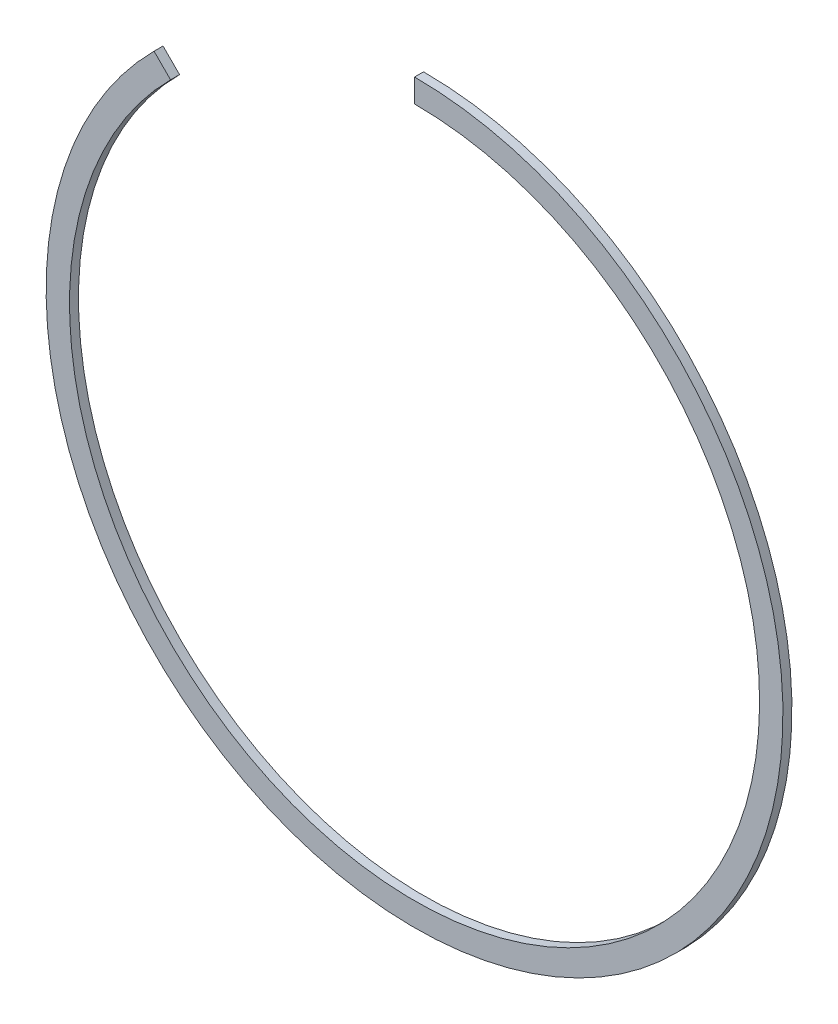
ISO-10303-21;
HEADER;
FILE_DESCRIPTION(('STEP AP214'),'2;1');
FILE_NAME('part.step','',(''),(''),'','','');
FILE_SCHEMA(('AUTOMOTIVE_DESIGN { 1 0 10303 214 1 1 1 1 }'));
ENDSEC;
DATA;
#1=APPLICATION_CONTEXT('core data for automotive mechanical design processes');
#2=APPLICATION_PROTOCOL_DEFINITION('international standard','automotive_design',2000,#1);
#3=PRODUCT_CONTEXT('',#1,'mechanical');
#4=PRODUCT('Part','Part','',(#3));
#5=PRODUCT_RELATED_PRODUCT_CATEGORY('part','',(#4));
#6=PRODUCT_DEFINITION_FORMATION('','',#4);
#7=PRODUCT_DEFINITION_CONTEXT('part definition',#1,'design');
#8=PRODUCT_DEFINITION('design','',#6,#7);
#9=PRODUCT_DEFINITION_SHAPE('','',#8);
#10=(LENGTH_UNIT() NAMED_UNIT(*) SI_UNIT(.MILLI.,.METRE.));
#11=(NAMED_UNIT(*) PLANE_ANGLE_UNIT() SI_UNIT($,.RADIAN.));
#12=(NAMED_UNIT(*) SI_UNIT($,.STERADIAN.) SOLID_ANGLE_UNIT());
#13=UNCERTAINTY_MEASURE_WITH_UNIT(LENGTH_MEASURE(1.E-05),#10,'distance_accuracy_value','');
#14=(GEOMETRIC_REPRESENTATION_CONTEXT(3) GLOBAL_UNCERTAINTY_ASSIGNED_CONTEXT((#13)) GLOBAL_UNIT_ASSIGNED_CONTEXT((#10,
#11,#12)) REPRESENTATION_CONTEXT('',''));
#15=CARTESIAN_POINT('',(0.,0.,0.));
#16=DIRECTION('',(0.,0.,1.));
#17=DIRECTION('',(1.,0.,0.));
#18=AXIS2_PLACEMENT_3D('',#15,#16,#17);
#19=CARTESIAN_POINT('',(0.,0.,2.5));
#20=DIRECTION('',(0.,0.,-1.));
#21=DIRECTION('',(-1.,0.,0.));
#22=AXIS2_PLACEMENT_3D('',#19,#20,#21);
#23=CYLINDRICAL_SURFACE('',#22,96.);
#24=CARTESIAN_POINT('',(0.,0.,0.));
#25=DIRECTION('',(0.,0.,1.));
#26=DIRECTION('',(1.,0.,0.));
#27=AXIS2_PLACEMENT_3D('',#24,#25,#26);
#28=CIRCLE('',#27,96.);
#29=CARTESIAN_POINT('',(-67.88225099392,67.8822509939086,0.));
#30=VERTEX_POINT('',#29);
#31=CARTESIAN_POINT('',(0.,96.,0.));
#32=VERTEX_POINT('',#31);
#33=EDGE_CURVE('E109',#30,#32,#28,.T.);
#34=ORIENTED_EDGE('',*,*,#33,.F.);
#35=DIRECTION('',(0.,0.,-1.));
#36=VECTOR('',#35,1.);
#37=CARTESIAN_POINT('',(-67.88225099392,67.8822509939086,2.5));
#38=LINE('',#37,#36);
#39=CARTESIAN_POINT('',(-67.88225099392,67.8822509939086,2.5));
#40=VERTEX_POINT('',#39);
#41=EDGE_CURVE('E11',#40,#30,#38,.T.);
#42=ORIENTED_EDGE('',*,*,#41,.F.);
#43=CARTESIAN_POINT('',(0.,0.,2.5));
#44=DIRECTION('',(0.,0.,1.));
#45=DIRECTION('',(1.,0.,0.));
#46=AXIS2_PLACEMENT_3D('',#43,#44,#45);
#47=CIRCLE('',#46,96.);
#48=CARTESIAN_POINT('',(0.,96.,2.5));
#49=VERTEX_POINT('',#48);
#50=EDGE_CURVE('E99',#40,#49,#47,.T.);
#51=ORIENTED_EDGE('',*,*,#50,.T.);
#52=DIRECTION('',(0.,0.,-1.));
#53=VECTOR('',#52,1.);
#54=CARTESIAN_POINT('',(0.,96.,2.5));
#55=LINE('',#54,#53);
#56=EDGE_CURVE('E55',#49,#32,#55,.T.);
#57=ORIENTED_EDGE('',*,*,#56,.T.);
#58=EDGE_LOOP('',(#34,#42,#51,#57));
#59=FACE_BOUND('',#58,.T.);
#60=ADVANCED_FACE('F38',(#59),#23,.F.);
#61=CARTESIAN_POINT('',(0.,0.,2.5));
#62=DIRECTION('',(0.707106781186488,0.707106781186607,0.));
#63=DIRECTION('',(-0.707106781186607,0.707106781186488,0.));
#64=AXIS2_PLACEMENT_3D('',#61,#62,#63);
#65=PLANE('',#64);
#66=DIRECTION('',(0.707106781186607,-0.707106781186488,0.));
#67=VECTOR('',#66,1.);
#68=CARTESIAN_POINT('',(0.,0.,0.));
#69=LINE('',#68,#67);
#70=CARTESIAN_POINT('',(-72.4784450716215,72.4784450716092,0.));
#71=VERTEX_POINT('',#70);
#72=EDGE_CURVE('E87',#71,#30,#69,.T.);
#73=ORIENTED_EDGE('',*,*,#72,.F.);
#74=DIRECTION('',(0.,0.,-1.));
#75=VECTOR('',#74,1.);
#76=CARTESIAN_POINT('',(-72.4784450716215,72.4784450716092,2.5));
#77=LINE('',#76,#75);
#78=CARTESIAN_POINT('',(-72.4784450716215,72.4784450716092,2.5));
#79=VERTEX_POINT('',#78);
#80=EDGE_CURVE('E47',#79,#71,#77,.T.);
#81=ORIENTED_EDGE('',*,*,#80,.F.);
#82=DIRECTION('',(0.707106781186607,-0.707106781186488,0.));
#83=VECTOR('',#82,1.);
#84=CARTESIAN_POINT('',(0.,0.,2.5));
#85=LINE('',#84,#83);
#86=EDGE_CURVE('E85',#79,#40,#85,.T.);
#87=ORIENTED_EDGE('',*,*,#86,.T.);
#88=ORIENTED_EDGE('',*,*,#41,.T.);
#89=EDGE_LOOP('',(#73,#81,#87,#88));
#90=FACE_BOUND('',#89,.T.);
#91=ADVANCED_FACE('F83',(#90),#65,.T.);
#92=CARTESIAN_POINT('',(0.,0.,2.5));
#93=DIRECTION('',(0.,0.,-1.));
#94=DIRECTION('',(-1.,0.,0.));
#95=AXIS2_PLACEMENT_3D('',#92,#93,#94);
#96=CYLINDRICAL_SURFACE('',#95,102.5);
#97=CARTESIAN_POINT('',(0.,0.,0.));
#98=DIRECTION('',(0.,0.,1.));
#99=DIRECTION('',(1.,0.,0.));
#100=AXIS2_PLACEMENT_3D('',#97,#98,#99);
#101=CIRCLE('',#100,102.5);
#102=CARTESIAN_POINT('',(0.,102.5,0.));
#103=VERTEX_POINT('',#102);
#104=EDGE_CURVE('E114',#71,#103,#101,.T.);
#105=ORIENTED_EDGE('',*,*,#104,.T.);
#106=DIRECTION('',(0.,0.,-1.));
#107=VECTOR('',#106,1.);
#108=CARTESIAN_POINT('',(0.,102.5,2.5));
#109=LINE('',#108,#107);
#110=CARTESIAN_POINT('',(0.,102.5,2.5));
#111=VERTEX_POINT('',#110);
#112=EDGE_CURVE('E69',#111,#103,#109,.T.);
#113=ORIENTED_EDGE('',*,*,#112,.F.);
#114=CARTESIAN_POINT('',(0.,0.,2.5));
#115=DIRECTION('',(0.,0.,1.));
#116=DIRECTION('',(1.,0.,0.));
#117=AXIS2_PLACEMENT_3D('',#114,#115,#116);
#118=CIRCLE('',#117,102.5);
#119=EDGE_CURVE('E91',#79,#111,#118,.T.);
#120=ORIENTED_EDGE('',*,*,#119,.F.);
#121=ORIENTED_EDGE('',*,*,#80,.T.);
#122=EDGE_LOOP('',(#105,#113,#120,#121));
#123=FACE_BOUND('',#122,.T.);
#124=ADVANCED_FACE('F92',(#123),#96,.T.);
#125=CARTESIAN_POINT('',(0.,0.,2.5));
#126=DIRECTION('',(-1.,0.,0.));
#127=DIRECTION('',(0.,0.,1.));
#128=AXIS2_PLACEMENT_3D('',#125,#126,#127);
#129=PLANE('',#128);
#130=DIRECTION('',(0.,1.,0.));
#131=VECTOR('',#130,1.);
#132=CARTESIAN_POINT('',(0.,0.,0.));
#133=LINE('',#132,#131);
#134=EDGE_CURVE('E104',#32,#103,#133,.T.);
#135=ORIENTED_EDGE('',*,*,#134,.F.);
#136=ORIENTED_EDGE('',*,*,#56,.F.);
#137=DIRECTION('',(0.,1.,0.));
#138=VECTOR('',#137,1.);
#139=CARTESIAN_POINT('',(0.,0.,2.5));
#140=LINE('',#139,#138);
#141=EDGE_CURVE('E96',#49,#111,#140,.T.);
#142=ORIENTED_EDGE('',*,*,#141,.T.);
#143=ORIENTED_EDGE('',*,*,#112,.T.);
#144=EDGE_LOOP('',(#135,#136,#142,#143));
#145=FACE_BOUND('',#144,.T.);
#146=ADVANCED_FACE('F132',(#145),#129,.T.);
#147=CARTESIAN_POINT('',(0.,0.,2.5));
#148=DIRECTION('',(0.,0.,1.));
#149=DIRECTION('',(1.,0.,0.));
#150=AXIS2_PLACEMENT_3D('',#147,#148,#149);
#151=PLANE('',#150);
#152=ORIENTED_EDGE('',*,*,#50,.F.);
#153=ORIENTED_EDGE('',*,*,#86,.F.);
#154=ORIENTED_EDGE('',*,*,#119,.T.);
#155=ORIENTED_EDGE('',*,*,#141,.F.);
#156=EDGE_LOOP('',(#152,#153,#154,#155));
#157=FACE_BOUND('',#156,.T.);
#158=ADVANCED_FACE('F98',(#157),#151,.T.);
#159=CARTESIAN_POINT('',(0.,0.,0.));
#160=DIRECTION('',(0.,0.,1.));
#161=DIRECTION('',(1.,0.,0.));
#162=AXIS2_PLACEMENT_3D('',#159,#160,#161);
#163=PLANE('',#162);
#164=ORIENTED_EDGE('',*,*,#33,.T.);
#165=ORIENTED_EDGE('',*,*,#134,.T.);
#166=ORIENTED_EDGE('',*,*,#104,.F.);
#167=ORIENTED_EDGE('',*,*,#72,.T.);
#168=EDGE_LOOP('',(#164,#165,#166,#167));
#169=FACE_BOUND('',#168,.T.);
#170=ADVANCED_FACE('F131',(#169),#163,.F.);
#171=CLOSED_SHELL('',(#60,#91,#124,#146,#158,#170));
#172=MANIFOLD_SOLID_BREP('B2',#171);
#173=ADVANCED_BREP_SHAPE_REPRESENTATION('',(#18,#172),#14);
#174=SHAPE_DEFINITION_REPRESENTATION(#9,#173);
ENDSEC;
END-ISO-10303-21;
